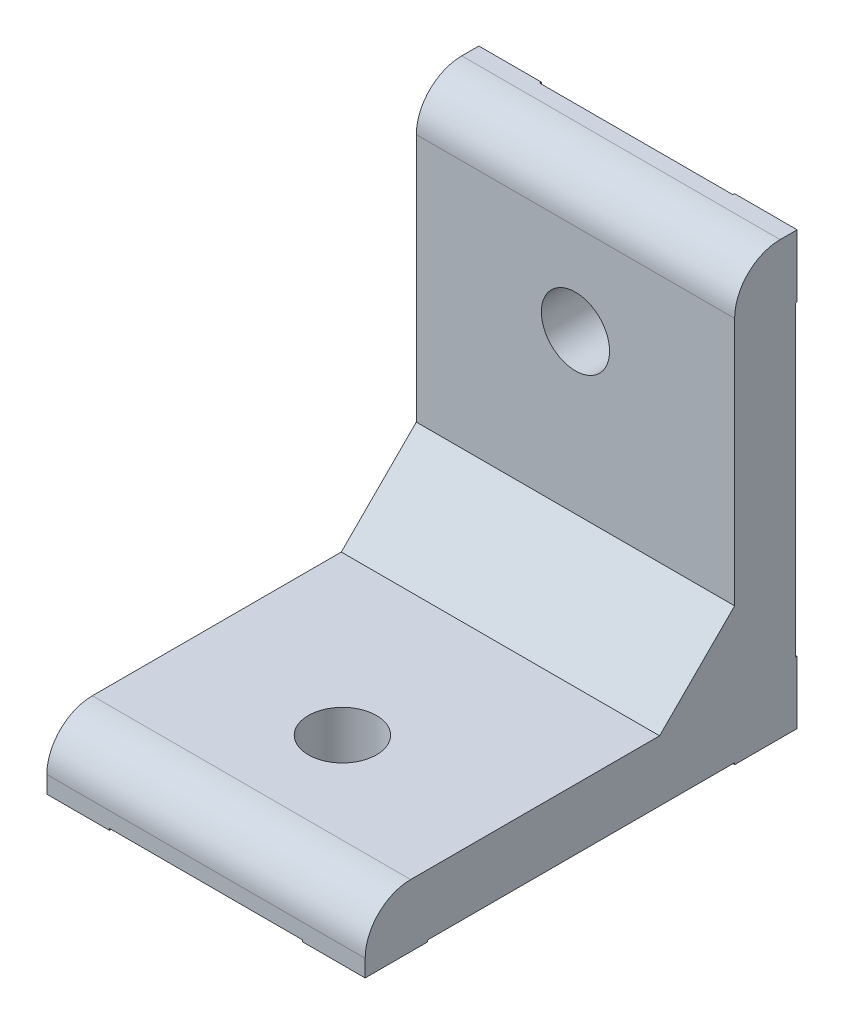
ISO-10303-21;
HEADER;
FILE_DESCRIPTION(('STEP AP214'),'2;1');
FILE_NAME('part.step','',(''),(''),'','','');
FILE_SCHEMA(('AUTOMOTIVE_DESIGN { 1 0 10303 214 1 1 1 1 }'));
ENDSEC;
DATA;
#1=APPLICATION_CONTEXT('core data for automotive mechanical design processes');
#2=APPLICATION_PROTOCOL_DEFINITION('international standard','automotive_design',2000,#1);
#3=PRODUCT_CONTEXT('',#1,'mechanical');
#4=PRODUCT('Part','Part','',(#3));
#5=PRODUCT_RELATED_PRODUCT_CATEGORY('part','',(#4));
#6=PRODUCT_DEFINITION_FORMATION('','',#4);
#7=PRODUCT_DEFINITION_CONTEXT('part definition',#1,'design');
#8=PRODUCT_DEFINITION('design','',#6,#7);
#9=PRODUCT_DEFINITION_SHAPE('','',#8);
#10=(LENGTH_UNIT() NAMED_UNIT(*) SI_UNIT(.MILLI.,.METRE.));
#11=(NAMED_UNIT(*) PLANE_ANGLE_UNIT() SI_UNIT($,.RADIAN.));
#12=(NAMED_UNIT(*) SI_UNIT($,.STERADIAN.) SOLID_ANGLE_UNIT());
#13=UNCERTAINTY_MEASURE_WITH_UNIT(LENGTH_MEASURE(1.E-05),#10,'distance_accuracy_value','');
#14=(GEOMETRIC_REPRESENTATION_CONTEXT(3) GLOBAL_UNCERTAINTY_ASSIGNED_CONTEXT((#13)) GLOBAL_UNIT_ASSIGNED_CONTEXT((#10,
#11,#12)) REPRESENTATION_CONTEXT('',''));
#15=CARTESIAN_POINT('',(0.,0.,0.));
#16=DIRECTION('',(0.,0.,1.));
#17=DIRECTION('',(1.,0.,0.));
#18=AXIS2_PLACEMENT_3D('',#15,#16,#17);
#19=CARTESIAN_POINT('',(-31.1337293774503,21.9881963728243,5.5));
#20=DIRECTION('',(0.,-1.,0.));
#21=DIRECTION('',(0.,0.,-1.));
#22=AXIS2_PLACEMENT_3D('',#19,#20,#21);
#23=PLANE('',#22);
#24=DIRECTION('',(0.,0.,-1.));
#25=VECTOR('',#24,1.);
#26=CARTESIAN_POINT('',(-25.6337293774504,21.9881963728243,0.15));
#27=LINE('',#26,#25);
#28=CARTESIAN_POINT('',(-25.6337293774504,21.9881963728243,0.15));
#29=VERTEX_POINT('',#28);
#30=CARTESIAN_POINT('',(-25.6337293774504,21.9881963728243,0.));
#31=VERTEX_POINT('',#30);
#32=EDGE_CURVE('E245',#29,#31,#27,.T.);
#33=ORIENTED_EDGE('',*,*,#32,.T.);
#34=DIRECTION('',(-1.,0.,0.));
#35=VECTOR('',#34,1.);
#36=CARTESIAN_POINT('',(-31.1337293774503,21.9881963728243,0.));
#37=LINE('',#36,#35);
#38=CARTESIAN_POINT('',(-31.1337293774503,21.9881963728243,0.));
#39=VERTEX_POINT('',#38);
#40=EDGE_CURVE('E548',#31,#39,#37,.T.);
#41=ORIENTED_EDGE('',*,*,#40,.T.);
#42=DIRECTION('',(0.,0.,-1.));
#43=VECTOR('',#42,1.);
#44=CARTESIAN_POINT('',(-31.1337293774503,21.9881963728243,5.5));
#45=LINE('',#44,#43);
#46=CARTESIAN_POINT('',(-31.1337293774503,21.9881963728243,1.49999999999997));
#47=VERTEX_POINT('',#46);
#48=EDGE_CURVE('E533',#47,#39,#45,.T.);
#49=ORIENTED_EDGE('',*,*,#48,.F.);
#50=DIRECTION('',(-1.,0.,0.));
#51=VECTOR('',#50,1.);
#52=CARTESIAN_POINT('',(-3.13372937745035,21.9881963728243,1.49999999999997));
#53=LINE('',#52,#51);
#54=CARTESIAN_POINT('',(-3.13372937745035,21.9881963728243,1.49999999999997));
#55=VERTEX_POINT('',#54);
#56=EDGE_CURVE('E486',#55,#47,#53,.T.);
#57=ORIENTED_EDGE('',*,*,#56,.F.);
#58=DIRECTION('',(0.,0.,-1.));
#59=VECTOR('',#58,1.);
#60=CARTESIAN_POINT('',(-3.13372937745035,21.9881963728243,5.5));
#61=LINE('',#60,#59);
#62=CARTESIAN_POINT('',(-3.13372937745035,21.9881963728243,0.));
#63=VERTEX_POINT('',#62);
#64=EDGE_CURVE('E554',#55,#63,#61,.T.);
#65=ORIENTED_EDGE('',*,*,#64,.T.);
#66=CARTESIAN_POINT('',(-8.63372937745035,21.9881963728243,0.));
#67=VERTEX_POINT('',#66);
#68=EDGE_CURVE('E530',#63,#67,#37,.T.);
#69=ORIENTED_EDGE('',*,*,#68,.T.);
#70=DIRECTION('',(0.,0.,-1.));
#71=VECTOR('',#70,1.);
#72=CARTESIAN_POINT('',(-8.63372937745035,21.9881963728243,0.15));
#73=LINE('',#72,#71);
#74=CARTESIAN_POINT('',(-8.63372937745035,21.9881963728243,0.15));
#75=VERTEX_POINT('',#74);
#76=EDGE_CURVE('E256',#75,#67,#73,.T.);
#77=ORIENTED_EDGE('',*,*,#76,.F.);
#78=DIRECTION('',(1.,0.,0.));
#79=VECTOR('',#78,1.);
#80=CARTESIAN_POINT('',(0.,21.9881963728243,0.15));
#81=LINE('',#80,#79);
#82=EDGE_CURVE('E263',#29,#75,#81,.T.);
#83=ORIENTED_EDGE('',*,*,#82,.F.);
#84=EDGE_LOOP('',(#33,#41,#49,#57,#65,#69,#77,#83));
#85=FACE_BOUND('',#84,.T.);
#86=ADVANCED_FACE('F39',(#85),#23,.F.);
#87=CARTESIAN_POINT('',(0.,0.,0.));
#88=DIRECTION('',(0.,0.,1.));
#89=DIRECTION('',(1.,0.,0.));
#90=AXIS2_PLACEMENT_3D('',#87,#88,#89);
#91=PLANE('',#90);
#92=DIRECTION('',(0.,-1.,0.));
#93=VECTOR('',#92,1.);
#94=CARTESIAN_POINT('',(-25.6337293774504,0.,0.));
#95=LINE('',#94,#93);
#96=CARTESIAN_POINT('',(-25.6337293774504,16.4881963728243,0.));
#97=VERTEX_POINT('',#96);
#98=EDGE_CURVE('E251',#31,#97,#95,.T.);
#99=ORIENTED_EDGE('',*,*,#98,.T.);
#100=DIRECTION('',(1.,0.,0.));
#101=VECTOR('',#100,1.);
#102=CARTESIAN_POINT('',(0.,16.4881963728243,0.));
#103=LINE('',#102,#101);
#104=CARTESIAN_POINT('',(-31.1337293774503,16.4881963728243,0.));
#105=VERTEX_POINT('',#104);
#106=EDGE_CURVE('E267',#105,#97,#103,.T.);
#107=ORIENTED_EDGE('',*,*,#106,.F.);
#108=DIRECTION('',(0.,-1.,0.));
#109=VECTOR('',#108,1.);
#110=CARTESIAN_POINT('',(-31.1337293774503,21.9881963728243,0.));
#111=LINE('',#110,#109);
#112=EDGE_CURVE('E534',#39,#105,#111,.T.);
#113=ORIENTED_EDGE('',*,*,#112,.F.);
#114=ORIENTED_EDGE('',*,*,#40,.F.);
#115=EDGE_LOOP('',(#99,#107,#113,#114));
#116=FACE_BOUND('',#115,.T.);
#117=ADVANCED_FACE('F662',(#116),#91,.F.);
#118=DIRECTION('',(1.,0.,0.));
#119=VECTOR('',#118,1.);
#120=CARTESIAN_POINT('',(0.,-10.5118036271757,0.));
#121=LINE('',#120,#119);
#122=CARTESIAN_POINT('',(-31.1337293774503,-10.5118036271757,0.));
#123=VERTEX_POINT('',#122);
#124=CARTESIAN_POINT('',(-25.6337293774504,-10.5118036271757,0.));
#125=VERTEX_POINT('',#124);
#126=EDGE_CURVE('E318',#123,#125,#121,.T.);
#127=ORIENTED_EDGE('',*,*,#126,.T.);
#128=DIRECTION('',(0.,-1.,0.));
#129=VECTOR('',#128,1.);
#130=CARTESIAN_POINT('',(-25.6337293774504,-15.8618036271757,0.));
#131=LINE('',#130,#129);
#132=CARTESIAN_POINT('',(-25.6337293774504,-16.0118036271757,0.));
#133=VERTEX_POINT('',#132);
#134=EDGE_CURVE('E439',#125,#133,#131,.T.);
#135=ORIENTED_EDGE('',*,*,#134,.T.);
#136=DIRECTION('',(1.,0.,0.));
#137=VECTOR('',#136,1.);
#138=CARTESIAN_POINT('',(-31.1337293774503,-16.0118036271757,0.));
#139=LINE('',#138,#137);
#140=CARTESIAN_POINT('',(-31.1337293774503,-16.0118036271757,0.));
#141=VERTEX_POINT('',#140);
#142=EDGE_CURVE('E539',#141,#133,#139,.T.);
#143=ORIENTED_EDGE('',*,*,#142,.F.);
#144=EDGE_CURVE('E524',#123,#141,#111,.T.);
#145=ORIENTED_EDGE('',*,*,#144,.F.);
#146=EDGE_LOOP('',(#127,#135,#143,#145));
#147=FACE_BOUND('',#146,.T.);
#148=ADVANCED_FACE('F667',(#147),#91,.F.);
#149=DIRECTION('',(0.,-1.,0.));
#150=VECTOR('',#149,1.);
#151=CARTESIAN_POINT('',(-8.63372937745035,-15.8618036271757,0.));
#152=LINE('',#151,#150);
#153=CARTESIAN_POINT('',(-8.63372937745035,-10.5118036271757,0.));
#154=VERTEX_POINT('',#153);
#155=CARTESIAN_POINT('',(-8.63372937745035,-16.0118036271757,0.));
#156=VERTEX_POINT('',#155);
#157=EDGE_CURVE('E436',#154,#156,#152,.T.);
#158=ORIENTED_EDGE('',*,*,#157,.F.);
#159=DIRECTION('',(-1.,0.,0.));
#160=VECTOR('',#159,1.);
#161=CARTESIAN_POINT('',(0.,-10.5118036271757,0.));
#162=LINE('',#161,#160);
#163=CARTESIAN_POINT('',(-3.13372937745035,-10.5118036271757,0.));
#164=VERTEX_POINT('',#163);
#165=EDGE_CURVE('E314',#164,#154,#162,.T.);
#166=ORIENTED_EDGE('',*,*,#165,.F.);
#167=DIRECTION('',(0.,1.,0.));
#168=VECTOR('',#167,1.);
#169=CARTESIAN_POINT('',(-3.13372937745035,21.9881963728243,0.));
#170=LINE('',#169,#168);
#171=CARTESIAN_POINT('',(-3.13372937745035,-16.0118036271757,0.));
#172=VERTEX_POINT('',#171);
#173=EDGE_CURVE('E544',#172,#164,#170,.T.);
#174=ORIENTED_EDGE('',*,*,#173,.F.);
#175=EDGE_CURVE('E538',#156,#172,#139,.T.);
#176=ORIENTED_EDGE('',*,*,#175,.F.);
#177=EDGE_LOOP('',(#158,#166,#174,#176));
#178=FACE_BOUND('',#177,.T.);
#179=ADVANCED_FACE('F582',(#178),#91,.F.);
#180=DIRECTION('',(-1.,0.,0.));
#181=VECTOR('',#180,1.);
#182=CARTESIAN_POINT('',(0.,16.4881963728243,0.));
#183=LINE('',#182,#181);
#184=CARTESIAN_POINT('',(-3.13372937745035,16.4881963728243,0.));
#185=VERTEX_POINT('',#184);
#186=CARTESIAN_POINT('',(-8.63372937745035,16.4881963728243,0.));
#187=VERTEX_POINT('',#186);
#188=EDGE_CURVE('E310',#185,#187,#183,.T.);
#189=ORIENTED_EDGE('',*,*,#188,.T.);
#190=DIRECTION('',(0.,-1.,0.));
#191=VECTOR('',#190,1.);
#192=CARTESIAN_POINT('',(-8.63372937745035,0.,0.));
#193=LINE('',#192,#191);
#194=EDGE_CURVE('E306',#67,#187,#193,.T.);
#195=ORIENTED_EDGE('',*,*,#194,.F.);
#196=ORIENTED_EDGE('',*,*,#68,.F.);
#197=EDGE_CURVE('E543',#185,#63,#170,.T.);
#198=ORIENTED_EDGE('',*,*,#197,.F.);
#199=EDGE_LOOP('',(#189,#195,#196,#198));
#200=FACE_BOUND('',#199,.T.);
#201=ADVANCED_FACE('F597',(#200),#91,.F.);
#202=CARTESIAN_POINT('',(0.,-15.8618036271757,0.));
#203=DIRECTION('',(0.,-1.,0.));
#204=DIRECTION('',(0.,0.,-1.));
#205=AXIS2_PLACEMENT_3D('',#202,#203,#204);
#206=PLANE('',#205);
#207=CARTESIAN_POINT('',(-17.1337293774504,-15.8618036271757,26.));
#208=DIRECTION('',(0.,-1.,0.));
#209=DIRECTION('',(0.,0.,-1.));
#210=AXIS2_PLACEMENT_3D('',#207,#208,#209);
#211=CIRCLE('',#210,3.);
#212=CARTESIAN_POINT('',(-17.1337293774504,-15.8618036271757,23.));
#213=VERTEX_POINT('',#212);
#214=EDGE_CURVE('E733',#213,#213,#211,.T.);
#215=ORIENTED_EDGE('',*,*,#214,.F.);
#216=EDGE_LOOP('',(#215));
#217=FACE_BOUND('',#216,.T.);
#218=DIRECTION('',(0.,0.,-1.));
#219=VECTOR('',#218,1.);
#220=CARTESIAN_POINT('',(-25.6337293774504,-15.8618036271757,0.));
#221=LINE('',#220,#219);
#222=CARTESIAN_POINT('',(-25.6337293774504,-15.8618036271757,5.5));
#223=VERTEX_POINT('',#222);
#224=CARTESIAN_POINT('',(-25.6337293774504,-15.8618036271757,0.15));
#225=VERTEX_POINT('',#224);
#226=EDGE_CURVE('E382',#223,#225,#221,.T.);
#227=ORIENTED_EDGE('',*,*,#226,.T.);
#228=DIRECTION('',(-1.,0.,0.));
#229=VECTOR('',#228,1.);
#230=CARTESIAN_POINT('',(0.,-15.8618036271757,0.15));
#231=LINE('',#230,#229);
#232=CARTESIAN_POINT('',(-8.63372937745035,-15.8618036271757,0.15));
#233=VERTEX_POINT('',#232);
#234=EDGE_CURVE('E289',#233,#225,#231,.T.);
#235=ORIENTED_EDGE('',*,*,#234,.F.);
#236=DIRECTION('',(0.,0.,1.));
#237=VECTOR('',#236,1.);
#238=CARTESIAN_POINT('',(-8.63372937745035,-15.8618036271757,0.));
#239=LINE('',#238,#237);
#240=CARTESIAN_POINT('',(-8.63372937745035,-15.8618036271757,5.5));
#241=VERTEX_POINT('',#240);
#242=EDGE_CURVE('E386',#233,#241,#239,.T.);
#243=ORIENTED_EDGE('',*,*,#242,.T.);
#244=DIRECTION('',(-1.,0.,0.));
#245=VECTOR('',#244,1.);
#246=CARTESIAN_POINT('',(0.,-15.8618036271757,5.5));
#247=LINE('',#246,#245);
#248=CARTESIAN_POINT('',(-3.13372937745035,-15.8618036271757,5.5));
#249=VERTEX_POINT('',#248);
#250=EDGE_CURVE('E389',#249,#241,#247,.T.);
#251=ORIENTED_EDGE('',*,*,#250,.F.);
#252=DIRECTION('',(0.,0.,1.));
#253=VECTOR('',#252,1.);
#254=CARTESIAN_POINT('',(-3.13372937745035,-15.8618036271757,0.));
#255=LINE('',#254,#253);
#256=CARTESIAN_POINT('',(-3.13372937745035,-15.8618036271757,32.5));
#257=VERTEX_POINT('',#256);
#258=EDGE_CURVE('E393',#249,#257,#255,.T.);
#259=ORIENTED_EDGE('',*,*,#258,.T.);
#260=DIRECTION('',(1.,0.,0.));
#261=VECTOR('',#260,1.);
#262=CARTESIAN_POINT('',(0.,-15.8618036271757,32.5));
#263=LINE('',#262,#261);
#264=CARTESIAN_POINT('',(-8.63372937745035,-15.8618036271757,32.5));
#265=VERTEX_POINT('',#264);
#266=EDGE_CURVE('E356',#265,#257,#263,.T.);
#267=ORIENTED_EDGE('',*,*,#266,.F.);
#268=DIRECTION('',(0.,0.,1.));
#269=VECTOR('',#268,1.);
#270=CARTESIAN_POINT('',(-8.63372937745035,-15.8618036271757,0.));
#271=LINE('',#270,#269);
#272=CARTESIAN_POINT('',(-8.63372937745035,-15.8618036271757,38.));
#273=VERTEX_POINT('',#272);
#274=EDGE_CURVE('E359',#265,#273,#271,.T.);
#275=ORIENTED_EDGE('',*,*,#274,.T.);
#276=DIRECTION('',(-1.,0.,0.));
#277=VECTOR('',#276,1.);
#278=CARTESIAN_POINT('',(0.,-15.8618036271757,38.));
#279=LINE('',#278,#277);
#280=CARTESIAN_POINT('',(-25.6337293774504,-15.8618036271757,38.));
#281=VERTEX_POINT('',#280);
#282=EDGE_CURVE('E364',#273,#281,#279,.T.);
#283=ORIENTED_EDGE('',*,*,#282,.T.);
#284=DIRECTION('',(0.,0.,1.));
#285=VECTOR('',#284,1.);
#286=CARTESIAN_POINT('',(-25.6337293774504,-15.8618036271757,0.));
#287=LINE('',#286,#285);
#288=CARTESIAN_POINT('',(-25.6337293774504,-15.8618036271757,32.5));
#289=VERTEX_POINT('',#288);
#290=EDGE_CURVE('E368',#289,#281,#287,.T.);
#291=ORIENTED_EDGE('',*,*,#290,.F.);
#292=DIRECTION('',(-1.,0.,0.));
#293=VECTOR('',#292,1.);
#294=CARTESIAN_POINT('',(0.,-15.8618036271757,32.5));
#295=LINE('',#294,#293);
#296=CARTESIAN_POINT('',(-31.1337293774503,-15.8618036271757,32.5));
#297=VERTEX_POINT('',#296);
#298=EDGE_CURVE('E371',#289,#297,#295,.T.);
#299=ORIENTED_EDGE('',*,*,#298,.T.);
#300=DIRECTION('',(0.,0.,-1.));
#301=VECTOR('',#300,1.);
#302=CARTESIAN_POINT('',(-31.1337293774503,-15.8618036271757,0.));
#303=LINE('',#302,#301);
#304=CARTESIAN_POINT('',(-31.1337293774503,-15.8618036271757,5.5));
#305=VERTEX_POINT('',#304);
#306=EDGE_CURVE('E375',#297,#305,#303,.T.);
#307=ORIENTED_EDGE('',*,*,#306,.T.);
#308=DIRECTION('',(-1.,0.,0.));
#309=VECTOR('',#308,1.);
#310=CARTESIAN_POINT('',(0.,-15.8618036271757,5.5));
#311=LINE('',#310,#309);
#312=EDGE_CURVE('E379',#223,#305,#311,.T.);
#313=ORIENTED_EDGE('',*,*,#312,.F.);
#314=EDGE_LOOP('',(#227,#235,#243,#251,#259,#267,#275,#283,#291,#299,#307,#313));
#315=FACE_BOUND('',#314,.T.);
#316=ADVANCED_FACE('F635',(#217,#315),#206,.T.);
#317=CARTESIAN_POINT('',(0.,0.,38.));
#318=DIRECTION('',(0.,0.,-1.));
#319=DIRECTION('',(-1.,0.,0.));
#320=AXIS2_PLACEMENT_3D('',#317,#318,#319);
#321=PLANE('',#320);
#322=DIRECTION('',(0.,-1.,0.));
#323=VECTOR('',#322,1.);
#324=CARTESIAN_POINT('',(-25.6337293774504,-15.8618036271757,38.));
#325=LINE('',#324,#323);
#326=CARTESIAN_POINT('',(-25.6337293774504,-16.0118036271757,38.));
#327=VERTEX_POINT('',#326);
#328=EDGE_CURVE('E456',#281,#327,#325,.T.);
#329=ORIENTED_EDGE('',*,*,#328,.F.);
#330=ORIENTED_EDGE('',*,*,#282,.F.);
#331=DIRECTION('',(0.,-1.,0.));
#332=VECTOR('',#331,1.);
#333=CARTESIAN_POINT('',(-8.63372937745035,-15.8618036271757,38.));
#334=LINE('',#333,#332);
#335=CARTESIAN_POINT('',(-8.63372937745035,-16.0118036271757,38.));
#336=VERTEX_POINT('',#335);
#337=EDGE_CURVE('E459',#273,#336,#334,.T.);
#338=ORIENTED_EDGE('',*,*,#337,.T.);
#339=DIRECTION('',(1.,0.,0.));
#340=VECTOR('',#339,1.);
#341=CARTESIAN_POINT('',(-31.1337293774503,-16.0118036271757,38.));
#342=LINE('',#341,#340);
#343=CARTESIAN_POINT('',(-3.13372937745035,-16.0118036271757,38.));
#344=VERTEX_POINT('',#343);
#345=EDGE_CURVE('E507',#336,#344,#342,.T.);
#346=ORIENTED_EDGE('',*,*,#345,.T.);
#347=DIRECTION('',(0.,1.,0.));
#348=VECTOR('',#347,1.);
#349=CARTESIAN_POINT('',(-3.13372937745035,-16.0118036271757,38.));
#350=LINE('',#349,#348);
#351=CARTESIAN_POINT('',(-3.13372937745035,-14.5118036271757,38.));
#352=VERTEX_POINT('',#351);
#353=EDGE_CURVE('E512',#344,#352,#350,.T.);
#354=ORIENTED_EDGE('',*,*,#353,.T.);
#355=DIRECTION('',(-1.,0.,0.));
#356=VECTOR('',#355,1.);
#357=CARTESIAN_POINT('',(-3.13372937745035,-14.5118036271757,38.));
#358=LINE('',#357,#356);
#359=CARTESIAN_POINT('',(-31.1337293774503,-14.5118036271757,38.));
#360=VERTEX_POINT('',#359);
#361=EDGE_CURVE('E482',#352,#360,#358,.T.);
#362=ORIENTED_EDGE('',*,*,#361,.T.);
#363=DIRECTION('',(0.,-1.,0.));
#364=VECTOR('',#363,1.);
#365=CARTESIAN_POINT('',(-31.1337293774503,-16.0118036271757,38.));
#366=LINE('',#365,#364);
#367=CARTESIAN_POINT('',(-31.1337293774503,-16.0118036271757,38.));
#368=VERTEX_POINT('',#367);
#369=EDGE_CURVE('E490',#360,#368,#366,.T.);
#370=ORIENTED_EDGE('',*,*,#369,.T.);
#371=EDGE_CURVE('E508',#368,#327,#342,.T.);
#372=ORIENTED_EDGE('',*,*,#371,.T.);
#373=EDGE_LOOP('',(#329,#330,#338,#346,#354,#362,#370,#372));
#374=FACE_BOUND('',#373,.T.);
#375=ADVANCED_FACE('F606',(#374),#321,.F.);
#376=CARTESIAN_POINT('',(-31.1337293774503,21.9881963728243,5.5));
#377=DIRECTION('',(1.,0.,0.));
#378=DIRECTION('',(0.,0.,-1.));
#379=AXIS2_PLACEMENT_3D('',#376,#377,#378);
#380=PLANE('',#379);
#381=ORIENTED_EDGE('',*,*,#112,.T.);
#382=DIRECTION('',(0.,0.,-1.));
#383=VECTOR('',#382,1.);
#384=CARTESIAN_POINT('',(-31.1337293774503,16.4881963728243,0.15));
#385=LINE('',#384,#383);
#386=CARTESIAN_POINT('',(-31.1337293774503,16.4881963728243,0.15));
#387=VERTEX_POINT('',#386);
#388=EDGE_CURVE('E329',#387,#105,#385,.T.);
#389=ORIENTED_EDGE('',*,*,#388,.F.);
#390=DIRECTION('',(0.,1.,0.));
#391=VECTOR('',#390,1.);
#392=CARTESIAN_POINT('',(-31.1337293774503,0.,0.15));
#393=LINE('',#392,#391);
#394=CARTESIAN_POINT('',(-31.1337293774503,-10.5118036271757,0.15));
#395=VERTEX_POINT('',#394);
#396=EDGE_CURVE('E299',#395,#387,#393,.T.);
#397=ORIENTED_EDGE('',*,*,#396,.F.);
#398=DIRECTION('',(0.,0.,-1.));
#399=VECTOR('',#398,1.);
#400=CARTESIAN_POINT('',(-31.1337293774503,-10.5118036271757,0.15));
#401=LINE('',#400,#399);
#402=EDGE_CURVE('E332',#395,#123,#401,.T.);
#403=ORIENTED_EDGE('',*,*,#402,.T.);
#404=ORIENTED_EDGE('',*,*,#144,.T.);
#405=DIRECTION('',(0.,0.,-1.));
#406=VECTOR('',#405,1.);
#407=CARTESIAN_POINT('',(-31.1337293774503,-16.0118036271757,5.5));
#408=LINE('',#407,#406);
#409=CARTESIAN_POINT('',(-31.1337293774503,-16.0118036271757,5.5));
#410=VERTEX_POINT('',#409);
#411=EDGE_CURVE('E49',#410,#141,#408,.T.);
#412=ORIENTED_EDGE('',*,*,#411,.F.);
#413=DIRECTION('',(0.,-1.,0.));
#414=VECTOR('',#413,1.);
#415=CARTESIAN_POINT('',(-31.1337293774503,-15.8618036271757,5.5));
#416=LINE('',#415,#414);
#417=EDGE_CURVE('E446',#305,#410,#416,.T.);
#418=ORIENTED_EDGE('',*,*,#417,.F.);
#419=ORIENTED_EDGE('',*,*,#306,.F.);
#420=DIRECTION('',(0.,-1.,0.));
#421=VECTOR('',#420,1.);
#422=CARTESIAN_POINT('',(-31.1337293774503,-15.8618036271757,32.5));
#423=LINE('',#422,#421);
#424=CARTESIAN_POINT('',(-31.1337293774503,-16.0118036271757,32.5));
#425=VERTEX_POINT('',#424);
#426=EDGE_CURVE('E449',#297,#425,#423,.T.);
#427=ORIENTED_EDGE('',*,*,#426,.T.);
#428=EDGE_CURVE('E11',#368,#425,#408,.T.);
#429=ORIENTED_EDGE('',*,*,#428,.F.);
#430=ORIENTED_EDGE('',*,*,#369,.F.);
#431=CARTESIAN_POINT('',(-31.1337293774503,-14.5118036271757,34.));
#432=DIRECTION('',(1.,0.,0.));
#433=DIRECTION('',(0.,0.,1.));
#434=AXIS2_PLACEMENT_3D('',#431,#432,#433);
#435=CIRCLE('',#434,4.);
#436=CARTESIAN_POINT('',(-31.1337293774503,-10.5118036271757,34.));
#437=VERTEX_POINT('',#436);
#438=EDGE_CURVE('E483',#437,#360,#435,.T.);
#439=ORIENTED_EDGE('',*,*,#438,.F.);
#440=DIRECTION('',(0.,0.,-1.));
#441=VECTOR('',#440,1.);
#442=CARTESIAN_POINT('',(-31.1337293774503,-10.5118036271757,38.));
#443=LINE('',#442,#441);
#444=CARTESIAN_POINT('',(-31.1337293774503,-10.5118036271757,12.1));
#445=VERTEX_POINT('',#444);
#446=EDGE_CURVE('E516',#437,#445,#443,.T.);
#447=ORIENTED_EDGE('',*,*,#446,.T.);
#448=DIRECTION('',(0.,0.707106781186544,-0.707106781186551));
#449=VECTOR('',#448,1.);
#450=CARTESIAN_POINT('',(-31.1337293774503,-10.5118036271757,12.1));
#451=LINE('',#450,#449);
#452=CARTESIAN_POINT('',(-31.1337293774503,-3.91180362717577,5.5));
#453=VERTEX_POINT('',#452);
#454=EDGE_CURVE('E428',#445,#453,#451,.T.);
#455=ORIENTED_EDGE('',*,*,#454,.T.);
#456=DIRECTION('',(0.,-1.,0.));
#457=VECTOR('',#456,1.);
#458=CARTESIAN_POINT('',(-31.1337293774503,21.9881963728243,5.5));
#459=LINE('',#458,#457);
#460=CARTESIAN_POINT('',(-31.1337293774503,17.9881963728243,5.5));
#461=VERTEX_POINT('',#460);
#462=EDGE_CURVE('E525',#461,#453,#459,.T.);
#463=ORIENTED_EDGE('',*,*,#462,.F.);
#464=CARTESIAN_POINT('',(-31.1337293774503,17.9881963728243,1.5));
#465=DIRECTION('',(1.,0.,0.));
#466=DIRECTION('',(0.,0.,1.));
#467=AXIS2_PLACEMENT_3D('',#464,#465,#466);
#468=CIRCLE('',#467,4.);
#469=EDGE_CURVE('E64',#47,#461,#468,.T.);
#470=ORIENTED_EDGE('',*,*,#469,.F.);
#471=ORIENTED_EDGE('',*,*,#48,.T.);
#472=EDGE_LOOP('',(#381,#389,#397,#403,#404,#412,#418,#419,#427,#429,#430,#439,#447,#455,#463,
#470,#471));
#473=FACE_BOUND('',#472,.T.);
#474=ADVANCED_FACE('F41',(#473),#380,.F.);
#475=CARTESIAN_POINT('',(-31.1337293774503,-16.0118036271757,5.5));
#476=DIRECTION('',(0.,1.,0.));
#477=DIRECTION('',(0.,0.,1.));
#478=AXIS2_PLACEMENT_3D('',#475,#476,#477);
#479=PLANE('',#478);
#480=DIRECTION('',(-1.,0.,0.));
#481=VECTOR('',#480,1.);
#482=CARTESIAN_POINT('',(0.,-16.0118036271757,5.5));
#483=LINE('',#482,#481);
#484=CARTESIAN_POINT('',(-3.13372937745035,-16.0118036271757,5.5));
#485=VERTEX_POINT('',#484);
#486=CARTESIAN_POINT('',(-8.63372937745035,-16.0118036271757,5.5));
#487=VERTEX_POINT('',#486);
#488=EDGE_CURVE('E360',#485,#487,#483,.T.);
#489=ORIENTED_EDGE('',*,*,#488,.T.);
#490=DIRECTION('',(0.,0.,1.));
#491=VECTOR('',#490,1.);
#492=CARTESIAN_POINT('',(-8.63372937745035,-16.0118036271757,0.));
#493=LINE('',#492,#491);
#494=EDGE_CURVE('E418',#156,#487,#493,.T.);
#495=ORIENTED_EDGE('',*,*,#494,.F.);
#496=ORIENTED_EDGE('',*,*,#175,.T.);
#497=DIRECTION('',(0.,0.,-1.));
#498=VECTOR('',#497,1.);
#499=CARTESIAN_POINT('',(-3.13372937745035,-16.0118036271757,5.5));
#500=LINE('',#499,#498);
#501=EDGE_CURVE('E558',#485,#172,#500,.T.);
#502=ORIENTED_EDGE('',*,*,#501,.F.);
#503=EDGE_LOOP('',(#489,#495,#496,#502));
#504=FACE_BOUND('',#503,.T.);
#505=ADVANCED_FACE('F578',(#504),#479,.F.);
#506=ORIENTED_EDGE('',*,*,#142,.T.);
#507=DIRECTION('',(0.,0.,-1.));
#508=VECTOR('',#507,1.);
#509=CARTESIAN_POINT('',(-25.6337293774504,-16.0118036271757,0.));
#510=LINE('',#509,#508);
#511=CARTESIAN_POINT('',(-25.6337293774504,-16.0118036271757,5.5));
#512=VERTEX_POINT('',#511);
#513=EDGE_CURVE('E415',#512,#133,#510,.T.);
#514=ORIENTED_EDGE('',*,*,#513,.F.);
#515=DIRECTION('',(-1.,0.,0.));
#516=VECTOR('',#515,1.);
#517=CARTESIAN_POINT('',(0.,-16.0118036271757,5.5));
#518=LINE('',#517,#516);
#519=EDGE_CURVE('E411',#512,#410,#518,.T.);
#520=ORIENTED_EDGE('',*,*,#519,.T.);
#521=ORIENTED_EDGE('',*,*,#411,.T.);
#522=EDGE_LOOP('',(#506,#514,#520,#521));
#523=FACE_BOUND('',#522,.T.);
#524=ADVANCED_FACE('F680',(#523),#479,.F.);
#525=DIRECTION('',(1.,0.,0.));
#526=VECTOR('',#525,1.);
#527=CARTESIAN_POINT('',(0.,-16.0118036271757,32.5));
#528=LINE('',#527,#526);
#529=CARTESIAN_POINT('',(-8.63372937745035,-16.0118036271757,32.5));
#530=VERTEX_POINT('',#529);
#531=CARTESIAN_POINT('',(-3.13372937745035,-16.0118036271757,32.5));
#532=VERTEX_POINT('',#531);
#533=EDGE_CURVE('E328',#530,#532,#528,.T.);
#534=ORIENTED_EDGE('',*,*,#533,.T.);
#535=EDGE_CURVE('E559',#344,#532,#500,.T.);
#536=ORIENTED_EDGE('',*,*,#535,.F.);
#537=ORIENTED_EDGE('',*,*,#345,.F.);
#538=DIRECTION('',(0.,0.,1.));
#539=VECTOR('',#538,1.);
#540=CARTESIAN_POINT('',(-8.63372937745035,-16.0118036271757,0.));
#541=LINE('',#540,#539);
#542=EDGE_CURVE('E401',#530,#336,#541,.T.);
#543=ORIENTED_EDGE('',*,*,#542,.F.);
#544=EDGE_LOOP('',(#534,#536,#537,#543));
#545=FACE_BOUND('',#544,.T.);
#546=ADVANCED_FACE('F610',(#545),#479,.F.);
#547=CARTESIAN_POINT('',(-3.13372937745035,21.9881963728243,5.5));
#548=DIRECTION('',(-1.,0.,0.));
#549=DIRECTION('',(0.,0.,1.));
#550=AXIS2_PLACEMENT_3D('',#547,#548,#549);
#551=PLANE('',#550);
#552=ORIENTED_EDGE('',*,*,#173,.T.);
#553=DIRECTION('',(0.,0.,-1.));
#554=VECTOR('',#553,1.);
#555=CARTESIAN_POINT('',(-3.13372937745035,-10.5118036271757,0.15));
#556=LINE('',#555,#554);
#557=CARTESIAN_POINT('',(-3.13372937745035,-10.5118036271757,0.15));
#558=VERTEX_POINT('',#557);
#559=EDGE_CURVE('E344',#558,#164,#556,.T.);
#560=ORIENTED_EDGE('',*,*,#559,.F.);
#561=DIRECTION('',(0.,-1.,0.));
#562=VECTOR('',#561,1.);
#563=CARTESIAN_POINT('',(-3.13372937745035,0.,0.15));
#564=LINE('',#563,#562);
#565=CARTESIAN_POINT('',(-3.13372937745035,16.4881963728243,0.15));
#566=VERTEX_POINT('',#565);
#567=EDGE_CURVE('E280',#566,#558,#564,.T.);
#568=ORIENTED_EDGE('',*,*,#567,.F.);
#569=DIRECTION('',(0.,0.,-1.));
#570=VECTOR('',#569,1.);
#571=CARTESIAN_POINT('',(-3.13372937745035,16.4881963728243,0.15));
#572=LINE('',#571,#570);
#573=EDGE_CURVE('E347',#566,#185,#572,.T.);
#574=ORIENTED_EDGE('',*,*,#573,.T.);
#575=ORIENTED_EDGE('',*,*,#197,.T.);
#576=ORIENTED_EDGE('',*,*,#64,.F.);
#577=CARTESIAN_POINT('',(-3.13372937745035,17.9881963728243,1.5));
#578=DIRECTION('',(1.,0.,0.));
#579=DIRECTION('',(0.,0.,1.));
#580=AXIS2_PLACEMENT_3D('',#577,#578,#579);
#581=CIRCLE('',#580,4.);
#582=CARTESIAN_POINT('',(-3.13372937745035,17.9881963728243,5.5));
#583=VERTEX_POINT('',#582);
#584=EDGE_CURVE('E494',#55,#583,#581,.T.);
#585=ORIENTED_EDGE('',*,*,#584,.T.);
#586=DIRECTION('',(0.,1.,0.));
#587=VECTOR('',#586,1.);
#588=CARTESIAN_POINT('',(-3.13372937745035,21.9881963728243,5.5));
#589=LINE('',#588,#587);
#590=CARTESIAN_POINT('',(-3.13372937745035,-3.91180362717577,5.5));
#591=VERTEX_POINT('',#590);
#592=EDGE_CURVE('E529',#591,#583,#589,.T.);
#593=ORIENTED_EDGE('',*,*,#592,.F.);
#594=DIRECTION('',(0.,0.707106781186544,-0.707106781186551));
#595=VECTOR('',#594,1.);
#596=CARTESIAN_POINT('',(-3.13372937745035,-10.5118036271757,12.1));
#597=LINE('',#596,#595);
#598=CARTESIAN_POINT('',(-3.13372937745035,-10.5118036271757,12.1));
#599=VERTEX_POINT('',#598);
#600=EDGE_CURVE('E465',#599,#591,#597,.T.);
#601=ORIENTED_EDGE('',*,*,#600,.F.);
#602=DIRECTION('',(0.,0.,-1.));
#603=VECTOR('',#602,1.);
#604=CARTESIAN_POINT('',(-3.13372937745035,-10.5118036271757,38.));
#605=LINE('',#604,#603);
#606=CARTESIAN_POINT('',(-3.13372937745035,-10.5118036271757,34.));
#607=VERTEX_POINT('',#606);
#608=EDGE_CURVE('E520',#607,#599,#605,.T.);
#609=ORIENTED_EDGE('',*,*,#608,.F.);
#610=CARTESIAN_POINT('',(-3.13372937745035,-14.5118036271757,34.));
#611=DIRECTION('',(1.,0.,0.));
#612=DIRECTION('',(0.,0.,1.));
#613=AXIS2_PLACEMENT_3D('',#610,#611,#612);
#614=CIRCLE('',#613,4.);
#615=EDGE_CURVE('E478',#607,#352,#614,.T.);
#616=ORIENTED_EDGE('',*,*,#615,.T.);
#617=ORIENTED_EDGE('',*,*,#353,.F.);
#618=ORIENTED_EDGE('',*,*,#535,.T.);
#619=DIRECTION('',(0.,-1.,0.));
#620=VECTOR('',#619,1.);
#621=CARTESIAN_POINT('',(-3.13372937745035,-15.8618036271757,32.5));
#622=LINE('',#621,#620);
#623=EDGE_CURVE('E425',#257,#532,#622,.T.);
#624=ORIENTED_EDGE('',*,*,#623,.F.);
#625=ORIENTED_EDGE('',*,*,#258,.F.);
#626=DIRECTION('',(0.,-1.,0.));
#627=VECTOR('',#626,1.);
#628=CARTESIAN_POINT('',(-3.13372937745035,-15.8618036271757,5.5));
#629=LINE('',#628,#627);
#630=EDGE_CURVE('E429',#249,#485,#629,.T.);
#631=ORIENTED_EDGE('',*,*,#630,.T.);
#632=ORIENTED_EDGE('',*,*,#501,.T.);
#633=EDGE_LOOP('',(#552,#560,#568,#574,#575,#576,#585,#593,#601,#609,#616,#617,#618,#624,#625,
#631,#632));
#634=FACE_BOUND('',#633,.T.);
#635=ADVANCED_FACE('F571',(#634),#551,.F.);
#636=ORIENTED_EDGE('',*,*,#428,.T.);
#637=DIRECTION('',(-1.,0.,0.));
#638=VECTOR('',#637,1.);
#639=CARTESIAN_POINT('',(0.,-16.0118036271757,32.5));
#640=LINE('',#639,#638);
#641=CARTESIAN_POINT('',(-25.6337293774504,-16.0118036271757,32.5));
#642=VERTEX_POINT('',#641);
#643=EDGE_CURVE('E408',#642,#425,#640,.T.);
#644=ORIENTED_EDGE('',*,*,#643,.F.);
#645=DIRECTION('',(0.,0.,1.));
#646=VECTOR('',#645,1.);
#647=CARTESIAN_POINT('',(-25.6337293774504,-16.0118036271757,0.));
#648=LINE('',#647,#646);
#649=EDGE_CURVE('E404',#642,#327,#648,.T.);
#650=ORIENTED_EDGE('',*,*,#649,.T.);
#651=ORIENTED_EDGE('',*,*,#371,.F.);
#652=EDGE_LOOP('',(#636,#644,#650,#651));
#653=FACE_BOUND('',#652,.T.);
#654=ADVANCED_FACE('F629',(#653),#479,.F.);
#655=CARTESIAN_POINT('',(0.,0.,5.5));
#656=DIRECTION('',(0.,0.,1.));
#657=DIRECTION('',(1.,0.,0.));
#658=AXIS2_PLACEMENT_3D('',#655,#656,#657);
#659=PLANE('',#658);
#660=CARTESIAN_POINT('',(-17.1337293774504,9.9881963728243,5.5));
#661=DIRECTION('',(0.,0.,1.));
#662=DIRECTION('',(1.,0.,0.));
#663=AXIS2_PLACEMENT_3D('',#660,#661,#662);
#664=CIRCLE('',#663,3.);
#665=CARTESIAN_POINT('',(-14.1337293774503,9.9881963728243,5.5));
#666=VERTEX_POINT('',#665);
#667=EDGE_CURVE('E736',#666,#666,#664,.T.);
#668=ORIENTED_EDGE('',*,*,#667,.F.);
#669=EDGE_LOOP('',(#668));
#670=FACE_BOUND('',#669,.T.);
#671=DIRECTION('',(-1.,0.,0.));
#672=VECTOR('',#671,1.);
#673=CARTESIAN_POINT('',(-3.13372937745035,-3.91180362717577,5.5));
#674=LINE('',#673,#672);
#675=EDGE_CURVE('E472',#591,#453,#674,.T.);
#676=ORIENTED_EDGE('',*,*,#675,.F.);
#677=ORIENTED_EDGE('',*,*,#592,.T.);
#678=DIRECTION('',(-1.,0.,0.));
#679=VECTOR('',#678,1.);
#680=CARTESIAN_POINT('',(-3.13372937745035,17.9881963728243,5.5));
#681=LINE('',#680,#679);
#682=EDGE_CURVE('E498',#583,#461,#681,.T.);
#683=ORIENTED_EDGE('',*,*,#682,.T.);
#684=ORIENTED_EDGE('',*,*,#462,.T.);
#685=EDGE_LOOP('',(#676,#677,#683,#684));
#686=FACE_BOUND('',#685,.T.);
#687=ADVANCED_FACE('F674',(#670,#686),#659,.T.);
#688=CARTESIAN_POINT('',(-31.1337293774503,-10.5118036271757,38.));
#689=DIRECTION('',(0.,-1.,0.));
#690=DIRECTION('',(0.,0.,-1.));
#691=AXIS2_PLACEMENT_3D('',#688,#689,#690);
#692=PLANE('',#691);
#693=CARTESIAN_POINT('',(-17.1337293774504,-10.5118036271757,26.));
#694=DIRECTION('',(0.,-1.,0.));
#695=DIRECTION('',(0.,0.,-1.));
#696=AXIS2_PLACEMENT_3D('',#693,#694,#695);
#697=CIRCLE('',#696,3.);
#698=CARTESIAN_POINT('',(-17.1337293774504,-10.5118036271757,23.));
#699=VERTEX_POINT('',#698);
#700=EDGE_CURVE('E43',#699,#699,#697,.T.);
#701=ORIENTED_EDGE('',*,*,#700,.T.);
#702=EDGE_LOOP('',(#701));
#703=FACE_BOUND('',#702,.T.);
#704=ORIENTED_EDGE('',*,*,#608,.T.);
#705=DIRECTION('',(-1.,0.,0.));
#706=VECTOR('',#705,1.);
#707=CARTESIAN_POINT('',(-3.13372937745035,-10.5118036271757,12.1));
#708=LINE('',#707,#706);
#709=EDGE_CURVE('E468',#599,#445,#708,.T.);
#710=ORIENTED_EDGE('',*,*,#709,.T.);
#711=ORIENTED_EDGE('',*,*,#446,.F.);
#712=DIRECTION('',(-1.,0.,0.));
#713=VECTOR('',#712,1.);
#714=CARTESIAN_POINT('',(-3.13372937745035,-10.5118036271757,34.));
#715=LINE('',#714,#713);
#716=EDGE_CURVE('E487',#607,#437,#715,.T.);
#717=ORIENTED_EDGE('',*,*,#716,.F.);
#718=EDGE_LOOP('',(#704,#710,#711,#717));
#719=FACE_BOUND('',#718,.T.);
#720=ADVANCED_FACE('F620',(#703,#719),#692,.F.);
#721=CARTESIAN_POINT('',(-3.13372937745035,-14.5118036271757,34.));
#722=DIRECTION('',(-1.,0.,0.));
#723=DIRECTION('',(0.,0.,1.));
#724=AXIS2_PLACEMENT_3D('',#721,#722,#723);
#725=CYLINDRICAL_SURFACE('',#724,4.);
#726=ORIENTED_EDGE('',*,*,#438,.T.);
#727=ORIENTED_EDGE('',*,*,#361,.F.);
#728=ORIENTED_EDGE('',*,*,#615,.F.);
#729=ORIENTED_EDGE('',*,*,#716,.T.);
#730=EDGE_LOOP('',(#726,#727,#728,#729));
#731=FACE_BOUND('',#730,.T.);
#732=ADVANCED_FACE('F616',(#731),#725,.T.);
#733=CARTESIAN_POINT('',(-3.13372937745035,17.9881963728243,1.5));
#734=DIRECTION('',(-1.,0.,0.));
#735=DIRECTION('',(0.,0.,1.));
#736=AXIS2_PLACEMENT_3D('',#733,#734,#735);
#737=CYLINDRICAL_SURFACE('',#736,4.);
#738=ORIENTED_EDGE('',*,*,#469,.T.);
#739=ORIENTED_EDGE('',*,*,#682,.F.);
#740=ORIENTED_EDGE('',*,*,#584,.F.);
#741=ORIENTED_EDGE('',*,*,#56,.T.);
#742=EDGE_LOOP('',(#738,#739,#740,#741));
#743=FACE_BOUND('',#742,.T.);
#744=ADVANCED_FACE('F708',(#743),#737,.T.);
#745=CARTESIAN_POINT('',(-3.13372937745035,-10.5118036271757,12.1));
#746=DIRECTION('',(0.,0.707106781186551,0.707106781186544));
#747=DIRECTION('',(0.,-0.707106781186544,0.707106781186551));
#748=AXIS2_PLACEMENT_3D('',#745,#746,#747);
#749=PLANE('',#748);
#750=ORIENTED_EDGE('',*,*,#454,.F.);
#751=ORIENTED_EDGE('',*,*,#709,.F.);
#752=ORIENTED_EDGE('',*,*,#600,.T.);
#753=ORIENTED_EDGE('',*,*,#675,.T.);
#754=EDGE_LOOP('',(#750,#751,#752,#753));
#755=FACE_BOUND('',#754,.T.);
#756=ADVANCED_FACE('F710',(#755),#749,.T.);
#757=CARTESIAN_POINT('',(0.,-15.8618036271757,32.5));
#758=DIRECTION('',(0.,0.,-1.));
#759=DIRECTION('',(-1.,0.,0.));
#760=AXIS2_PLACEMENT_3D('',#757,#758,#759);
#761=PLANE('',#760);
#762=ORIENTED_EDGE('',*,*,#533,.F.);
#763=DIRECTION('',(0.,-1.,0.));
#764=VECTOR('',#763,1.);
#765=CARTESIAN_POINT('',(-8.63372937745035,-15.8618036271757,32.5));
#766=LINE('',#765,#764);
#767=EDGE_CURVE('E397',#265,#530,#766,.T.);
#768=ORIENTED_EDGE('',*,*,#767,.F.);
#769=ORIENTED_EDGE('',*,*,#266,.T.);
#770=ORIENTED_EDGE('',*,*,#623,.T.);
#771=EDGE_LOOP('',(#762,#768,#769,#770));
#772=FACE_BOUND('',#771,.T.);
#773=ADVANCED_FACE('F642',(#772),#761,.T.);
#774=CARTESIAN_POINT('',(0.,-15.8618036271757,5.5));
#775=DIRECTION('',(0.,0.,1.));
#776=DIRECTION('',(1.,0.,0.));
#777=AXIS2_PLACEMENT_3D('',#774,#775,#776);
#778=PLANE('',#777);
#779=ORIENTED_EDGE('',*,*,#488,.F.);
#780=ORIENTED_EDGE('',*,*,#630,.F.);
#781=ORIENTED_EDGE('',*,*,#250,.T.);
#782=DIRECTION('',(0.,-1.,0.));
#783=VECTOR('',#782,1.);
#784=CARTESIAN_POINT('',(-8.63372937745035,-15.8618036271757,5.5));
#785=LINE('',#784,#783);
#786=EDGE_CURVE('E433',#241,#487,#785,.T.);
#787=ORIENTED_EDGE('',*,*,#786,.T.);
#788=EDGE_LOOP('',(#779,#780,#781,#787));
#789=FACE_BOUND('',#788,.T.);
#790=ADVANCED_FACE('F647',(#789),#778,.T.);
#791=CARTESIAN_POINT('',(-8.63372937745035,-15.8618036271757,0.));
#792=DIRECTION('',(1.,0.,0.));
#793=DIRECTION('',(0.,0.,-1.));
#794=AXIS2_PLACEMENT_3D('',#791,#792,#793);
#795=PLANE('',#794);
#796=ORIENTED_EDGE('',*,*,#494,.T.);
#797=ORIENTED_EDGE('',*,*,#786,.F.);
#798=ORIENTED_EDGE('',*,*,#242,.F.);
#799=DIRECTION('',(0.,1.,0.));
#800=VECTOR('',#799,1.);
#801=CARTESIAN_POINT('',(-8.63372937745035,0.,0.15));
#802=LINE('',#801,#800);
#803=CARTESIAN_POINT('',(-8.63372937745035,-10.5118036271757,0.15));
#804=VERTEX_POINT('',#803);
#805=EDGE_CURVE('E56',#233,#804,#802,.T.);
#806=ORIENTED_EDGE('',*,*,#805,.T.);
#807=DIRECTION('',(0.,0.,-1.));
#808=VECTOR('',#807,1.);
#809=CARTESIAN_POINT('',(-8.63372937745035,-10.5118036271757,0.15));
#810=LINE('',#809,#808);
#811=EDGE_CURVE('E340',#804,#154,#810,.T.);
#812=ORIENTED_EDGE('',*,*,#811,.T.);
#813=ORIENTED_EDGE('',*,*,#157,.T.);
#814=EDGE_LOOP('',(#796,#797,#798,#806,#812,#813));
#815=FACE_BOUND('',#814,.T.);
#816=ADVANCED_FACE('F649',(#815),#795,.F.);
#817=CARTESIAN_POINT('',(-25.6337293774504,-15.8618036271757,0.));
#818=DIRECTION('',(-1.,0.,0.));
#819=DIRECTION('',(0.,0.,1.));
#820=AXIS2_PLACEMENT_3D('',#817,#818,#819);
#821=PLANE('',#820);
#822=ORIENTED_EDGE('',*,*,#513,.T.);
#823=ORIENTED_EDGE('',*,*,#134,.F.);
#824=DIRECTION('',(0.,0.,-1.));
#825=VECTOR('',#824,1.);
#826=CARTESIAN_POINT('',(-25.6337293774504,-10.5118036271757,0.15));
#827=LINE('',#826,#825);
#828=CARTESIAN_POINT('',(-25.6337293774504,-10.5118036271757,0.15));
#829=VERTEX_POINT('',#828);
#830=EDGE_CURVE('E336',#829,#125,#827,.T.);
#831=ORIENTED_EDGE('',*,*,#830,.F.);
#832=DIRECTION('',(0.,1.,0.));
#833=VECTOR('',#832,1.);
#834=CARTESIAN_POINT('',(-25.6337293774504,0.,0.15));
#835=LINE('',#834,#833);
#836=EDGE_CURVE('E292',#225,#829,#835,.T.);
#837=ORIENTED_EDGE('',*,*,#836,.F.);
#838=ORIENTED_EDGE('',*,*,#226,.F.);
#839=DIRECTION('',(0.,-1.,0.));
#840=VECTOR('',#839,1.);
#841=CARTESIAN_POINT('',(-25.6337293774504,-15.8618036271757,5.5));
#842=LINE('',#841,#840);
#843=EDGE_CURVE('E443',#223,#512,#842,.T.);
#844=ORIENTED_EDGE('',*,*,#843,.T.);
#845=EDGE_LOOP('',(#822,#823,#831,#837,#838,#844));
#846=FACE_BOUND('',#845,.T.);
#847=ADVANCED_FACE('F651',(#846),#821,.F.);
#848=CARTESIAN_POINT('',(0.,-15.8618036271757,5.5));
#849=DIRECTION('',(0.,0.,1.));
#850=DIRECTION('',(1.,0.,0.));
#851=AXIS2_PLACEMENT_3D('',#848,#849,#850);
#852=PLANE('',#851);
#853=ORIENTED_EDGE('',*,*,#519,.F.);
#854=ORIENTED_EDGE('',*,*,#843,.F.);
#855=ORIENTED_EDGE('',*,*,#312,.T.);
#856=ORIENTED_EDGE('',*,*,#417,.T.);
#857=EDGE_LOOP('',(#853,#854,#855,#856));
#858=FACE_BOUND('',#857,.T.);
#859=ADVANCED_FACE('F657',(#858),#852,.T.);
#860=CARTESIAN_POINT('',(0.,-15.8618036271757,32.5));
#861=DIRECTION('',(0.,0.,1.));
#862=DIRECTION('',(1.,0.,0.));
#863=AXIS2_PLACEMENT_3D('',#860,#861,#862);
#864=PLANE('',#863);
#865=ORIENTED_EDGE('',*,*,#643,.T.);
#866=ORIENTED_EDGE('',*,*,#426,.F.);
#867=ORIENTED_EDGE('',*,*,#298,.F.);
#868=DIRECTION('',(0.,-1.,0.));
#869=VECTOR('',#868,1.);
#870=CARTESIAN_POINT('',(-25.6337293774504,-15.8618036271757,32.5));
#871=LINE('',#870,#869);
#872=EDGE_CURVE('E453',#289,#642,#871,.T.);
#873=ORIENTED_EDGE('',*,*,#872,.T.);
#874=EDGE_LOOP('',(#865,#866,#867,#873));
#875=FACE_BOUND('',#874,.T.);
#876=ADVANCED_FACE('F810',(#875),#864,.F.);
#877=CARTESIAN_POINT('',(-25.6337293774504,-15.8618036271757,0.));
#878=DIRECTION('',(1.,0.,0.));
#879=DIRECTION('',(0.,0.,-1.));
#880=AXIS2_PLACEMENT_3D('',#877,#878,#879);
#881=PLANE('',#880);
#882=ORIENTED_EDGE('',*,*,#649,.F.);
#883=ORIENTED_EDGE('',*,*,#872,.F.);
#884=ORIENTED_EDGE('',*,*,#290,.T.);
#885=ORIENTED_EDGE('',*,*,#328,.T.);
#886=EDGE_LOOP('',(#882,#883,#884,#885));
#887=FACE_BOUND('',#886,.T.);
#888=ADVANCED_FACE('F632',(#887),#881,.T.);
#889=CARTESIAN_POINT('',(-8.63372937745035,-15.8618036271757,0.));
#890=DIRECTION('',(1.,0.,0.));
#891=DIRECTION('',(0.,0.,-1.));
#892=AXIS2_PLACEMENT_3D('',#889,#890,#891);
#893=PLANE('',#892);
#894=ORIENTED_EDGE('',*,*,#542,.T.);
#895=ORIENTED_EDGE('',*,*,#337,.F.);
#896=ORIENTED_EDGE('',*,*,#274,.F.);
#897=ORIENTED_EDGE('',*,*,#767,.T.);
#898=EDGE_LOOP('',(#894,#895,#896,#897));
#899=FACE_BOUND('',#898,.T.);
#900=ADVANCED_FACE('F640',(#899),#893,.F.);
#901=CARTESIAN_POINT('',(-25.6337293774504,0.,0.15));
#902=DIRECTION('',(1.,0.,0.));
#903=DIRECTION('',(0.,0.,-1.));
#904=AXIS2_PLACEMENT_3D('',#901,#902,#903);
#905=PLANE('',#904);
#906=ORIENTED_EDGE('',*,*,#98,.F.);
#907=ORIENTED_EDGE('',*,*,#32,.F.);
#908=DIRECTION('',(0.,-1.,0.));
#909=VECTOR('',#908,1.);
#910=CARTESIAN_POINT('',(-25.6337293774504,0.,0.15));
#911=LINE('',#910,#909);
#912=CARTESIAN_POINT('',(-25.6337293774504,16.4881963728243,0.15));
#913=VERTEX_POINT('',#912);
#914=EDGE_CURVE('E248',#29,#913,#911,.T.);
#915=ORIENTED_EDGE('',*,*,#914,.T.);
#916=DIRECTION('',(0.,0.,-1.));
#917=VECTOR('',#916,1.);
#918=CARTESIAN_POINT('',(-25.6337293774504,16.4881963728243,0.15));
#919=LINE('',#918,#917);
#920=EDGE_CURVE('E325',#913,#97,#919,.T.);
#921=ORIENTED_EDGE('',*,*,#920,.T.);
#922=EDGE_LOOP('',(#906,#907,#915,#921));
#923=FACE_BOUND('',#922,.T.);
#924=ADVANCED_FACE('F247',(#923),#905,.T.);
#925=CARTESIAN_POINT('',(0.,16.4881963728243,0.15));
#926=DIRECTION('',(0.,1.,0.));
#927=DIRECTION('',(0.,0.,1.));
#928=AXIS2_PLACEMENT_3D('',#925,#926,#927);
#929=PLANE('',#928);
#930=ORIENTED_EDGE('',*,*,#106,.T.);
#931=ORIENTED_EDGE('',*,*,#920,.F.);
#932=DIRECTION('',(1.,0.,0.));
#933=VECTOR('',#932,1.);
#934=CARTESIAN_POINT('',(0.,16.4881963728243,0.15));
#935=LINE('',#934,#933);
#936=EDGE_CURVE('E257',#387,#913,#935,.T.);
#937=ORIENTED_EDGE('',*,*,#936,.F.);
#938=ORIENTED_EDGE('',*,*,#388,.T.);
#939=EDGE_LOOP('',(#930,#931,#937,#938));
#940=FACE_BOUND('',#939,.T.);
#941=ADVANCED_FACE('F702',(#940),#929,.F.);
#942=CARTESIAN_POINT('',(0.,-10.5118036271757,0.15));
#943=DIRECTION('',(0.,1.,0.));
#944=DIRECTION('',(0.,0.,1.));
#945=AXIS2_PLACEMENT_3D('',#942,#943,#944);
#946=PLANE('',#945);
#947=ORIENTED_EDGE('',*,*,#126,.F.);
#948=ORIENTED_EDGE('',*,*,#402,.F.);
#949=DIRECTION('',(1.,0.,0.));
#950=VECTOR('',#949,1.);
#951=CARTESIAN_POINT('',(0.,-10.5118036271757,0.15));
#952=LINE('',#951,#950);
#953=EDGE_CURVE('E296',#395,#829,#952,.T.);
#954=ORIENTED_EDGE('',*,*,#953,.T.);
#955=ORIENTED_EDGE('',*,*,#830,.T.);
#956=EDGE_LOOP('',(#947,#948,#954,#955));
#957=FACE_BOUND('',#956,.T.);
#958=ADVANCED_FACE('F695',(#957),#946,.T.);
#959=CARTESIAN_POINT('',(0.,-10.5118036271757,0.15));
#960=DIRECTION('',(0.,-1.,0.));
#961=DIRECTION('',(0.,0.,-1.));
#962=AXIS2_PLACEMENT_3D('',#959,#960,#961);
#963=PLANE('',#962);
#964=ORIENTED_EDGE('',*,*,#165,.T.);
#965=ORIENTED_EDGE('',*,*,#811,.F.);
#966=DIRECTION('',(-1.,0.,0.));
#967=VECTOR('',#966,1.);
#968=CARTESIAN_POINT('',(0.,-10.5118036271757,0.15));
#969=LINE('',#968,#967);
#970=EDGE_CURVE('E284',#558,#804,#969,.T.);
#971=ORIENTED_EDGE('',*,*,#970,.F.);
#972=ORIENTED_EDGE('',*,*,#559,.T.);
#973=EDGE_LOOP('',(#964,#965,#971,#972));
#974=FACE_BOUND('',#973,.T.);
#975=ADVANCED_FACE('F585',(#974),#963,.F.);
#976=CARTESIAN_POINT('',(0.,16.4881963728243,0.15));
#977=DIRECTION('',(0.,-1.,0.));
#978=DIRECTION('',(0.,0.,-1.));
#979=AXIS2_PLACEMENT_3D('',#976,#977,#978);
#980=PLANE('',#979);
#981=ORIENTED_EDGE('',*,*,#188,.F.);
#982=ORIENTED_EDGE('',*,*,#573,.F.);
#983=DIRECTION('',(-1.,0.,0.));
#984=VECTOR('',#983,1.);
#985=CARTESIAN_POINT('',(0.,16.4881963728243,0.15));
#986=LINE('',#985,#984);
#987=CARTESIAN_POINT('',(-8.63372937745035,16.4881963728243,0.15));
#988=VERTEX_POINT('',#987);
#989=EDGE_CURVE('E274',#566,#988,#986,.T.);
#990=ORIENTED_EDGE('',*,*,#989,.T.);
#991=DIRECTION('',(0.,0.,-1.));
#992=VECTOR('',#991,1.);
#993=CARTESIAN_POINT('',(-8.63372937745035,16.4881963728243,0.15));
#994=LINE('',#993,#992);
#995=EDGE_CURVE('E351',#988,#187,#994,.T.);
#996=ORIENTED_EDGE('',*,*,#995,.T.);
#997=EDGE_LOOP('',(#981,#982,#990,#996));
#998=FACE_BOUND('',#997,.T.);
#999=ADVANCED_FACE('F591',(#998),#980,.T.);
#1000=CARTESIAN_POINT('',(-8.63372937745035,0.,0.15));
#1001=DIRECTION('',(1.,0.,0.));
#1002=DIRECTION('',(0.,0.,-1.));
#1003=AXIS2_PLACEMENT_3D('',#1000,#1001,#1002);
#1004=PLANE('',#1003);
#1005=ORIENTED_EDGE('',*,*,#194,.T.);
#1006=ORIENTED_EDGE('',*,*,#995,.F.);
#1007=DIRECTION('',(0.,-1.,0.));
#1008=VECTOR('',#1007,1.);
#1009=CARTESIAN_POINT('',(-8.63372937745035,0.,0.15));
#1010=LINE('',#1009,#1008);
#1011=EDGE_CURVE('E271',#75,#988,#1010,.T.);
#1012=ORIENTED_EDGE('',*,*,#1011,.F.);
#1013=ORIENTED_EDGE('',*,*,#76,.T.);
#1014=EDGE_LOOP('',(#1005,#1006,#1012,#1013));
#1015=FACE_BOUND('',#1014,.T.);
#1016=ADVANCED_FACE('F593',(#1015),#1004,.F.);
#1017=CARTESIAN_POINT('',(0.,0.,0.15));
#1018=DIRECTION('',(0.,0.,-1.));
#1019=DIRECTION('',(-1.,0.,0.));
#1020=AXIS2_PLACEMENT_3D('',#1017,#1018,#1019);
#1021=PLANE('',#1020);
#1022=CARTESIAN_POINT('',(-17.1337293774504,9.9881963728243,0.15));
#1023=DIRECTION('',(0.,0.,-1.));
#1024=DIRECTION('',(-1.,0.,0.));
#1025=AXIS2_PLACEMENT_3D('',#1022,#1023,#1024);
#1026=CIRCLE('',#1025,3.);
#1027=CARTESIAN_POINT('',(-20.1337293774504,9.9881963728243,0.15));
#1028=VERTEX_POINT('',#1027);
#1029=EDGE_CURVE('E741',#1028,#1028,#1026,.T.);
#1030=ORIENTED_EDGE('',*,*,#1029,.F.);
#1031=EDGE_LOOP('',(#1030));
#1032=FACE_BOUND('',#1031,.T.);
#1033=ORIENTED_EDGE('',*,*,#914,.F.);
#1034=ORIENTED_EDGE('',*,*,#82,.T.);
#1035=ORIENTED_EDGE('',*,*,#1011,.T.);
#1036=ORIENTED_EDGE('',*,*,#989,.F.);
#1037=ORIENTED_EDGE('',*,*,#567,.T.);
#1038=ORIENTED_EDGE('',*,*,#970,.T.);
#1039=ORIENTED_EDGE('',*,*,#805,.F.);
#1040=ORIENTED_EDGE('',*,*,#234,.T.);
#1041=ORIENTED_EDGE('',*,*,#836,.T.);
#1042=ORIENTED_EDGE('',*,*,#953,.F.);
#1043=ORIENTED_EDGE('',*,*,#396,.T.);
#1044=ORIENTED_EDGE('',*,*,#936,.T.);
#1045=EDGE_LOOP('',(#1033,#1034,#1035,#1036,#1037,#1038,#1039,#1040,#1041,#1042,#1043,#1044));
#1046=FACE_BOUND('',#1045,.T.);
#1047=ADVANCED_FACE('F261',(#1032,#1046),#1021,.T.);
#1048=CARTESIAN_POINT('',(-17.1337293774504,-9.8618036271757,26.));
#1049=DIRECTION('',(0.,-1.,0.));
#1050=DIRECTION('',(0.,0.,-1.));
#1051=AXIS2_PLACEMENT_3D('',#1048,#1049,#1050);
#1052=CYLINDRICAL_SURFACE('',#1051,3.);
#1053=ORIENTED_EDGE('',*,*,#214,.T.);
#1054=EDGE_LOOP('',(#1053));
#1055=FACE_BOUND('',#1054,.T.);
#1056=ORIENTED_EDGE('',*,*,#700,.F.);
#1057=EDGE_LOOP('',(#1056));
#1058=FACE_BOUND('',#1057,.T.);
#1059=ADVANCED_FACE('F751',(#1055,#1058),#1052,.F.);
#1060=CARTESIAN_POINT('',(-17.1337293774504,9.9881963728243,6.15));
#1061=DIRECTION('',(0.,0.,-1.));
#1062=DIRECTION('',(-1.,0.,0.));
#1063=AXIS2_PLACEMENT_3D('',#1060,#1061,#1062);
#1064=CYLINDRICAL_SURFACE('',#1063,3.);
#1065=ORIENTED_EDGE('',*,*,#667,.T.);
#1066=EDGE_LOOP('',(#1065));
#1067=FACE_BOUND('',#1066,.T.);
#1068=ORIENTED_EDGE('',*,*,#1029,.T.);
#1069=EDGE_LOOP('',(#1068));
#1070=FACE_BOUND('',#1069,.T.);
#1071=ADVANCED_FACE('F748',(#1067,#1070),#1064,.F.);
#1072=CLOSED_SHELL('',(#86,#117,#148,#179,#201,#316,#375,#474,#505,#524,#546,#635,#654,#687,
#720,#732,#744,#756,#773,#790,#816,#847,#859,#876,#888,#900,#924,#941,#958,#975,#999,#1016,
#1047,#1059,#1071));
#1073=MANIFOLD_SOLID_BREP('B2',#1072);
#1074=ADVANCED_BREP_SHAPE_REPRESENTATION('',(#18,#1073),#14);
#1075=SHAPE_DEFINITION_REPRESENTATION(#9,#1074);
ENDSEC;
END-ISO-10303-21;
